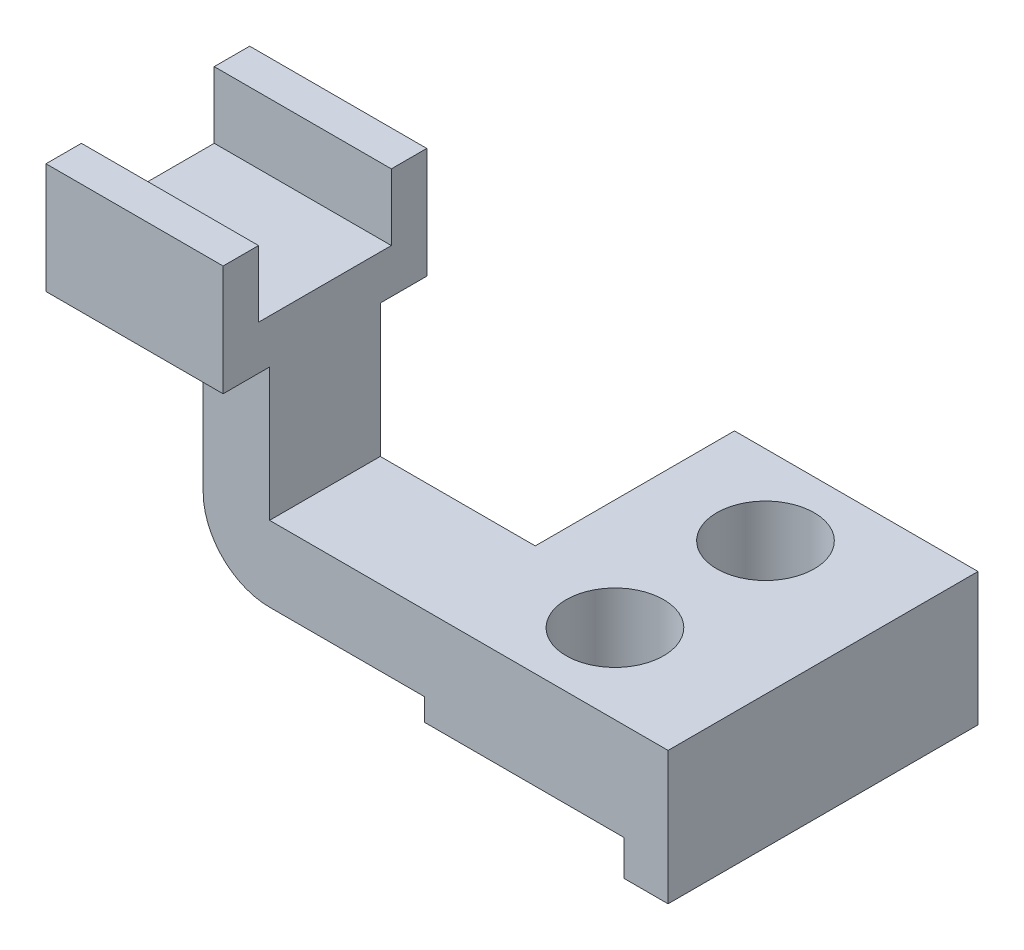
ISO-10303-21;
HEADER;
FILE_DESCRIPTION(('STEP AP214'),'2;1');
FILE_NAME('part.step','',(''),(''),'','','');
FILE_SCHEMA(('AUTOMOTIVE_DESIGN { 1 0 10303 214 1 1 1 1 }'));
ENDSEC;
DATA;
#1=APPLICATION_CONTEXT('core data for automotive mechanical design processes');
#2=APPLICATION_PROTOCOL_DEFINITION('international standard','automotive_design',2000,#1);
#3=PRODUCT_CONTEXT('',#1,'mechanical');
#4=PRODUCT('Part','Part','',(#3));
#5=PRODUCT_RELATED_PRODUCT_CATEGORY('part','',(#4));
#6=PRODUCT_DEFINITION_FORMATION('','',#4);
#7=PRODUCT_DEFINITION_CONTEXT('part definition',#1,'design');
#8=PRODUCT_DEFINITION('design','',#6,#7);
#9=PRODUCT_DEFINITION_SHAPE('','',#8);
#10=(LENGTH_UNIT() NAMED_UNIT(*) SI_UNIT(.MILLI.,.METRE.));
#11=(NAMED_UNIT(*) PLANE_ANGLE_UNIT() SI_UNIT($,.RADIAN.));
#12=(NAMED_UNIT(*) SI_UNIT($,.STERADIAN.) SOLID_ANGLE_UNIT());
#13=UNCERTAINTY_MEASURE_WITH_UNIT(LENGTH_MEASURE(1.E-05),#10,'distance_accuracy_value','');
#14=(GEOMETRIC_REPRESENTATION_CONTEXT(3) GLOBAL_UNCERTAINTY_ASSIGNED_CONTEXT((#13)) GLOBAL_UNIT_ASSIGNED_CONTEXT((#10,
#11,#12)) REPRESENTATION_CONTEXT('',''));
#15=CARTESIAN_POINT('',(0.,0.,0.));
#16=DIRECTION('',(0.,0.,1.));
#17=DIRECTION('',(1.,0.,0.));
#18=AXIS2_PLACEMENT_3D('',#15,#16,#17);
#19=CARTESIAN_POINT('',(0.,69.6989025069569,0.));
#20=DIRECTION('',(0.,1.,0.));
#21=DIRECTION('',(0.,0.,1.));
#22=AXIS2_PLACEMENT_3D('',#19,#20,#21);
#23=PLANE('',#22);
#24=DIRECTION('',(1.,0.,0.));
#25=VECTOR('',#24,1.);
#26=CARTESIAN_POINT('',(0.,69.6989025069569,2.5));
#27=LINE('',#26,#25);
#28=CARTESIAN_POINT('',(-90.8897650489965,69.6989025069569,2.5));
#29=VERTEX_POINT('',#28);
#30=CARTESIAN_POINT('',(-50.8897650489965,69.6989025069569,2.5));
#31=VERTEX_POINT('',#30);
#32=EDGE_CURVE('E366',#29,#31,#27,.T.);
#33=ORIENTED_EDGE('',*,*,#32,.F.);
#34=DIRECTION('',(0.,0.,1.));
#35=VECTOR('',#34,1.);
#36=CARTESIAN_POINT('',(-90.8897650489965,69.6989025069569,0.));
#37=LINE('',#36,#35);
#38=CARTESIAN_POINT('',(-90.8897650489965,69.6989025069569,10.5));
#39=VERTEX_POINT('',#38);
#40=EDGE_CURVE('E357',#29,#39,#37,.T.);
#41=ORIENTED_EDGE('',*,*,#40,.T.);
#42=DIRECTION('',(1.,0.,0.));
#43=VECTOR('',#42,1.);
#44=CARTESIAN_POINT('',(0.,69.6989025069569,10.5));
#45=LINE('',#44,#43);
#46=CARTESIAN_POINT('',(-50.8897650489965,69.6989025069569,10.5));
#47=VERTEX_POINT('',#46);
#48=EDGE_CURVE('E268',#39,#47,#45,.T.);
#49=ORIENTED_EDGE('',*,*,#48,.T.);
#50=DIRECTION('',(0.,0.,-1.));
#51=VECTOR('',#50,1.);
#52=CARTESIAN_POINT('',(-50.8897650489965,69.6989025069569,0.));
#53=LINE('',#52,#51);
#54=EDGE_CURVE('E341',#47,#31,#53,.T.);
#55=ORIENTED_EDGE('',*,*,#54,.T.);
#56=EDGE_LOOP('',(#33,#41,#49,#55));
#57=FACE_BOUND('',#56,.T.);
#58=ADVANCED_FACE('F41',(#57),#23,.T.);
#59=CARTESIAN_POINT('',(0.,0.,-25.));
#60=DIRECTION('',(0.,0.,1.));
#61=DIRECTION('',(1.,0.,0.));
#62=AXIS2_PLACEMENT_3D('',#59,#60,#61);
#63=PLANE('',#62);
#64=DIRECTION('',(0.,1.,0.));
#65=VECTOR('',#64,1.);
#66=CARTESIAN_POINT('',(-15.8897650489965,-2.30109749304307,-25.));
#67=LINE('',#66,#65);
#68=CARTESIAN_POINT('',(-15.8897650489965,-2.30109749304307,-25.));
#69=VERTEX_POINT('',#68);
#70=CARTESIAN_POINT('',(-15.8897650489965,14.6989025069569,-25.));
#71=VERTEX_POINT('',#70);
#72=EDGE_CURVE('E11',#69,#71,#67,.T.);
#73=ORIENTED_EDGE('',*,*,#72,.F.);
#74=DIRECTION('',(1.,0.,0.));
#75=VECTOR('',#74,1.);
#76=CARTESIAN_POINT('',(0.,-2.30109749304307,-25.));
#77=LINE('',#76,#75);
#78=CARTESIAN_POINT('',(-50.8897650489965,-2.30109749304307,-25.));
#79=VERTEX_POINT('',#78);
#80=EDGE_CURVE('E148',#79,#69,#77,.T.);
#81=ORIENTED_EDGE('',*,*,#80,.F.);
#82=CARTESIAN_POINT('',(-50.8897650489965,12.6989025069569,-25.));
#83=DIRECTION('',(0.,0.,1.));
#84=DIRECTION('',(1.,0.,0.));
#85=AXIS2_PLACEMENT_3D('',#82,#83,#84);
#86=CIRCLE('',#85,15.);
#87=CARTESIAN_POINT('',(-65.8897650489965,12.6989025069569,-25.));
#88=VERTEX_POINT('',#87);
#89=EDGE_CURVE('E130',#88,#79,#86,.T.);
#90=ORIENTED_EDGE('',*,*,#89,.F.);
#91=DIRECTION('',(0.,1.,0.));
#92=VECTOR('',#91,1.);
#93=CARTESIAN_POINT('',(-65.8897650489965,0.,-25.));
#94=LINE('',#93,#92);
#95=CARTESIAN_POINT('',(-65.8897650489965,44.6989025069569,-25.));
#96=VERTEX_POINT('',#95);
#97=EDGE_CURVE('E140',#88,#96,#94,.T.);
#98=ORIENTED_EDGE('',*,*,#97,.T.);
#99=DIRECTION('',(1.,0.,0.));
#100=VECTOR('',#99,1.);
#101=CARTESIAN_POINT('',(0.,44.6989025069569,-25.));
#102=LINE('',#101,#100);
#103=CARTESIAN_POINT('',(-50.8897650489965,44.6989025069569,-25.));
#104=VERTEX_POINT('',#103);
#105=EDGE_CURVE('E144',#96,#104,#102,.T.);
#106=ORIENTED_EDGE('',*,*,#105,.T.);
#107=DIRECTION('',(0.,-1.,0.));
#108=VECTOR('',#107,1.);
#109=CARTESIAN_POINT('',(-50.8897650489965,0.,-25.));
#110=LINE('',#109,#108);
#111=CARTESIAN_POINT('',(-50.8897650489965,14.6989025069569,-25.));
#112=VERTEX_POINT('',#111);
#113=EDGE_CURVE('E241',#104,#112,#110,.T.);
#114=ORIENTED_EDGE('',*,*,#113,.T.);
#115=DIRECTION('',(-1.,0.,0.));
#116=VECTOR('',#115,1.);
#117=CARTESIAN_POINT('',(0.,14.6989025069569,-25.));
#118=LINE('',#117,#116);
#119=EDGE_CURVE('E112',#71,#112,#118,.T.);
#120=ORIENTED_EDGE('',*,*,#119,.F.);
#121=EDGE_LOOP('',(#73,#81,#90,#98,#106,#114,#120));
#122=FACE_BOUND('',#121,.T.);
#123=ADVANCED_FACE('F146',(#122),#63,.F.);
#124=CARTESIAN_POINT('',(0.,-15.3155808543021,-25.));
#125=DIRECTION('',(0.,-1.,0.));
#126=DIRECTION('',(0.,0.,-1.));
#127=AXIS2_PLACEMENT_3D('',#124,#125,#126);
#128=PLANE('',#127);
#129=DIRECTION('',(1.,0.,0.));
#130=VECTOR('',#129,1.);
#131=CARTESIAN_POINT('',(0.,-15.3155808543021,0.));
#132=LINE('',#131,#130);
#133=CARTESIAN_POINT('',(29.1102349510035,-15.3155808543021,0.));
#134=VERTEX_POINT('',#133);
#135=CARTESIAN_POINT('',(39.1102349510035,-15.3155808543021,0.));
#136=VERTEX_POINT('',#135);
#137=EDGE_CURVE('E153',#134,#136,#132,.T.);
#138=ORIENTED_EDGE('',*,*,#137,.F.);
#139=DIRECTION('',(0.,0.,1.));
#140=VECTOR('',#139,1.);
#141=CARTESIAN_POINT('',(29.1102349510035,-15.3155808543021,-25.));
#142=LINE('',#141,#140);
#143=CARTESIAN_POINT('',(29.1102349510035,-15.3155808543021,-70.));
#144=VERTEX_POINT('',#143);
#145=EDGE_CURVE('E50',#144,#134,#142,.T.);
#146=ORIENTED_EDGE('',*,*,#145,.F.);
#147=DIRECTION('',(-1.,0.,0.));
#148=VECTOR('',#147,1.);
#149=CARTESIAN_POINT('',(39.1102349510035,-15.3155808543021,-70.));
#150=LINE('',#149,#148);
#151=CARTESIAN_POINT('',(39.1102349510035,-15.3155808543021,-70.));
#152=VERTEX_POINT('',#151);
#153=EDGE_CURVE('E204',#152,#144,#150,.T.);
#154=ORIENTED_EDGE('',*,*,#153,.F.);
#155=DIRECTION('',(0.,0.,1.));
#156=VECTOR('',#155,1.);
#157=CARTESIAN_POINT('',(39.1102349510035,-15.3155808543021,-25.));
#158=LINE('',#157,#156);
#159=EDGE_CURVE('E45',#152,#136,#158,.T.);
#160=ORIENTED_EDGE('',*,*,#159,.T.);
#161=EDGE_LOOP('',(#138,#146,#154,#160));
#162=FACE_BOUND('',#161,.T.);
#163=ADVANCED_FACE('F43',(#162),#128,.T.);
#164=CARTESIAN_POINT('',(29.1102349510035,0.,-25.));
#165=DIRECTION('',(-1.,0.,0.));
#166=DIRECTION('',(0.,0.,1.));
#167=AXIS2_PLACEMENT_3D('',#164,#165,#166);
#168=PLANE('',#167);
#169=DIRECTION('',(0.,-1.,0.));
#170=VECTOR('',#169,1.);
#171=CARTESIAN_POINT('',(29.1102349510035,0.,0.));
#172=LINE('',#171,#170);
#173=CARTESIAN_POINT('',(29.1102349510035,-7.31558085430206,0.));
#174=VERTEX_POINT('',#173);
#175=EDGE_CURVE('E181',#174,#134,#172,.T.);
#176=ORIENTED_EDGE('',*,*,#175,.F.);
#177=DIRECTION('',(0.,0.,1.));
#178=VECTOR('',#177,1.);
#179=CARTESIAN_POINT('',(29.1102349510035,-7.31558085430206,-25.));
#180=LINE('',#179,#178);
#181=CARTESIAN_POINT('',(29.1102349510035,-7.31558085430206,-70.));
#182=VERTEX_POINT('',#181);
#183=EDGE_CURVE('E185',#182,#174,#180,.T.);
#184=ORIENTED_EDGE('',*,*,#183,.F.);
#185=DIRECTION('',(0.,1.,0.));
#186=VECTOR('',#185,1.);
#187=CARTESIAN_POINT('',(29.1102349510035,-15.3155808543021,-70.));
#188=LINE('',#187,#186);
#189=EDGE_CURVE('E215',#144,#182,#188,.T.);
#190=ORIENTED_EDGE('',*,*,#189,.F.);
#191=ORIENTED_EDGE('',*,*,#145,.T.);
#192=EDGE_LOOP('',(#176,#184,#190,#191));
#193=FACE_BOUND('',#192,.T.);
#194=ADVANCED_FACE('F211',(#193),#168,.T.);
#195=CARTESIAN_POINT('',(0.,-7.31558085430206,-25.));
#196=DIRECTION('',(0.,-1.,0.));
#197=DIRECTION('',(0.,0.,-1.));
#198=AXIS2_PLACEMENT_3D('',#195,#196,#197);
#199=PLANE('',#198);
#200=CARTESIAN_POINT('',(9.11023495100352,-7.31558085430206,-18.));
#201=DIRECTION('',(0.,-1.,0.));
#202=DIRECTION('',(0.,0.,-1.));
#203=AXIS2_PLACEMENT_3D('',#200,#201,#202);
#204=CIRCLE('',#203,11.);
#205=CARTESIAN_POINT('',(-1.88976504899648,-7.31558085430206,-18.));
#206=VERTEX_POINT('',#205);
#207=EDGE_CURVE('E372',#206,#206,#204,.T.);
#208=ORIENTED_EDGE('',*,*,#207,.F.);
#209=EDGE_LOOP('',(#208));
#210=FACE_BOUND('',#209,.T.);
#211=CARTESIAN_POINT('',(9.11023495100352,-7.31558085430206,-52.));
#212=DIRECTION('',(0.,-1.,0.));
#213=DIRECTION('',(0.,0.,-1.));
#214=AXIS2_PLACEMENT_3D('',#211,#212,#213);
#215=CIRCLE('',#214,11.);
#216=CARTESIAN_POINT('',(-1.88976504899648,-7.31558085430206,-52.));
#217=VERTEX_POINT('',#216);
#218=EDGE_CURVE('E385',#217,#217,#215,.T.);
#219=ORIENTED_EDGE('',*,*,#218,.F.);
#220=EDGE_LOOP('',(#219));
#221=FACE_BOUND('',#220,.T.);
#222=DIRECTION('',(1.,0.,0.));
#223=VECTOR('',#222,1.);
#224=CARTESIAN_POINT('',(0.,-7.31558085430206,0.));
#225=LINE('',#224,#223);
#226=CARTESIAN_POINT('',(-15.8897650489965,-7.31558085430206,0.));
#227=VERTEX_POINT('',#226);
#228=EDGE_CURVE('E178',#227,#174,#225,.T.);
#229=ORIENTED_EDGE('',*,*,#228,.F.);
#230=DIRECTION('',(0.,0.,1.));
#231=VECTOR('',#230,1.);
#232=CARTESIAN_POINT('',(-15.8897650489965,-7.31558085430206,-25.));
#233=LINE('',#232,#231);
#234=CARTESIAN_POINT('',(-15.8897650489965,-7.31558085430206,-70.));
#235=VERTEX_POINT('',#234);
#236=EDGE_CURVE('E187',#235,#227,#233,.T.);
#237=ORIENTED_EDGE('',*,*,#236,.F.);
#238=DIRECTION('',(-1.,0.,0.));
#239=VECTOR('',#238,1.);
#240=CARTESIAN_POINT('',(29.1102349510035,-7.31558085430206,-70.));
#241=LINE('',#240,#239);
#242=EDGE_CURVE('E224',#182,#235,#241,.T.);
#243=ORIENTED_EDGE('',*,*,#242,.F.);
#244=ORIENTED_EDGE('',*,*,#183,.T.);
#245=EDGE_LOOP('',(#229,#237,#243,#244));
#246=FACE_BOUND('',#245,.T.);
#247=ADVANCED_FACE('F228',(#210,#221,#246),#199,.T.);
#248=CARTESIAN_POINT('',(-15.8897650489965,0.,-25.));
#249=DIRECTION('',(-1.,0.,0.));
#250=DIRECTION('',(0.,0.,1.));
#251=AXIS2_PLACEMENT_3D('',#248,#249,#250);
#252=PLANE('',#251);
#253=DIRECTION('',(0.,-1.,0.));
#254=VECTOR('',#253,1.);
#255=CARTESIAN_POINT('',(-15.8897650489965,0.,0.));
#256=LINE('',#255,#254);
#257=CARTESIAN_POINT('',(-15.8897650489965,-2.30109749304307,0.));
#258=VERTEX_POINT('',#257);
#259=EDGE_CURVE('E175',#258,#227,#256,.T.);
#260=ORIENTED_EDGE('',*,*,#259,.F.);
#261=DIRECTION('',(0.,0.,1.));
#262=VECTOR('',#261,1.);
#263=CARTESIAN_POINT('',(-15.8897650489965,-2.30109749304307,-25.));
#264=LINE('',#263,#262);
#265=EDGE_CURVE('E189',#69,#258,#264,.T.);
#266=ORIENTED_EDGE('',*,*,#265,.F.);
#267=ORIENTED_EDGE('',*,*,#72,.T.);
#268=DIRECTION('',(0.,0.,1.));
#269=VECTOR('',#268,1.);
#270=CARTESIAN_POINT('',(-15.8897650489965,14.6989025069569,-70.));
#271=LINE('',#270,#269);
#272=CARTESIAN_POINT('',(-15.8897650489965,14.6989025069569,-70.));
#273=VERTEX_POINT('',#272);
#274=EDGE_CURVE('E157',#273,#71,#271,.T.);
#275=ORIENTED_EDGE('',*,*,#274,.F.);
#276=DIRECTION('',(0.,1.,0.));
#277=VECTOR('',#276,1.);
#278=CARTESIAN_POINT('',(-15.8897650489965,-2.30109749304307,-70.));
#279=LINE('',#278,#277);
#280=EDGE_CURVE('E229',#235,#273,#279,.T.);
#281=ORIENTED_EDGE('',*,*,#280,.F.);
#282=ORIENTED_EDGE('',*,*,#236,.T.);
#283=EDGE_LOOP('',(#260,#266,#267,#275,#281,#282));
#284=FACE_BOUND('',#283,.T.);
#285=ADVANCED_FACE('F332',(#284),#252,.T.);
#286=CARTESIAN_POINT('',(0.,-2.30109749304307,-25.));
#287=DIRECTION('',(0.,-1.,0.));
#288=DIRECTION('',(1.,0.,0.));
#289=AXIS2_PLACEMENT_3D('',#286,#287,#288);
#290=PLANE('',#289);
#291=DIRECTION('',(1.,0.,0.));
#292=VECTOR('',#291,1.);
#293=CARTESIAN_POINT('',(0.,-2.30109749304307,0.));
#294=LINE('',#293,#292);
#295=CARTESIAN_POINT('',(-50.8897650489965,-2.30109749304307,0.));
#296=VERTEX_POINT('',#295);
#297=EDGE_CURVE('E172',#296,#258,#294,.T.);
#298=ORIENTED_EDGE('',*,*,#297,.F.);
#299=DIRECTION('',(0.,0.,1.));
#300=VECTOR('',#299,1.);
#301=CARTESIAN_POINT('',(-50.8897650489965,-2.30109749304307,-25.));
#302=LINE('',#301,#300);
#303=EDGE_CURVE('E136',#79,#296,#302,.T.);
#304=ORIENTED_EDGE('',*,*,#303,.F.);
#305=ORIENTED_EDGE('',*,*,#80,.T.);
#306=ORIENTED_EDGE('',*,*,#265,.T.);
#307=EDGE_LOOP('',(#298,#304,#305,#306));
#308=FACE_BOUND('',#307,.T.);
#309=ADVANCED_FACE('F335',(#308),#290,.T.);
#310=CARTESIAN_POINT('',(-50.8897650489965,12.6989025069569,-25.));
#311=DIRECTION('',(0.,0.,1.));
#312=DIRECTION('',(1.,0.,0.));
#313=AXIS2_PLACEMENT_3D('',#310,#311,#312);
#314=CYLINDRICAL_SURFACE('',#313,15.);
#315=CARTESIAN_POINT('',(-50.8897650489965,12.6989025069569,0.));
#316=DIRECTION('',(0.,0.,1.));
#317=DIRECTION('',(1.,0.,0.));
#318=AXIS2_PLACEMENT_3D('',#315,#316,#317);
#319=CIRCLE('',#318,15.);
#320=CARTESIAN_POINT('',(-65.8897650489965,12.6989025069569,0.));
#321=VERTEX_POINT('',#320);
#322=EDGE_CURVE('E132',#321,#296,#319,.T.);
#323=ORIENTED_EDGE('',*,*,#322,.F.);
#324=DIRECTION('',(0.,0.,1.));
#325=VECTOR('',#324,1.);
#326=CARTESIAN_POINT('',(-65.8897650489965,12.6989025069569,-25.));
#327=LINE('',#326,#325);
#328=EDGE_CURVE('E126',#88,#321,#327,.T.);
#329=ORIENTED_EDGE('',*,*,#328,.F.);
#330=ORIENTED_EDGE('',*,*,#89,.T.);
#331=ORIENTED_EDGE('',*,*,#303,.T.);
#332=EDGE_LOOP('',(#323,#329,#330,#331));
#333=FACE_BOUND('',#332,.T.);
#334=ADVANCED_FACE('F128',(#333),#314,.T.);
#335=CARTESIAN_POINT('',(-65.8897650489965,0.,-25.));
#336=DIRECTION('',(1.,0.,0.));
#337=DIRECTION('',(0.,1.,0.));
#338=AXIS2_PLACEMENT_3D('',#335,#336,#337);
#339=PLANE('',#338);
#340=DIRECTION('',(0.,1.,0.));
#341=VECTOR('',#340,1.);
#342=CARTESIAN_POINT('',(-65.8897650489965,0.,0.));
#343=LINE('',#342,#341);
#344=CARTESIAN_POINT('',(-65.8897650489965,44.6989025069569,0.));
#345=VERTEX_POINT('',#344);
#346=EDGE_CURVE('E169',#321,#345,#343,.T.);
#347=ORIENTED_EDGE('',*,*,#346,.T.);
#348=DIRECTION('',(0.,0.,1.));
#349=VECTOR('',#348,1.);
#350=CARTESIAN_POINT('',(-65.8897650489965,44.6989025069569,-25.));
#351=LINE('',#350,#349);
#352=EDGE_CURVE('E137',#96,#345,#351,.T.);
#353=ORIENTED_EDGE('',*,*,#352,.F.);
#354=ORIENTED_EDGE('',*,*,#97,.F.);
#355=ORIENTED_EDGE('',*,*,#328,.T.);
#356=EDGE_LOOP('',(#347,#353,#354,#355));
#357=FACE_BOUND('',#356,.T.);
#358=ADVANCED_FACE('F141',(#357),#339,.F.);
#359=CARTESIAN_POINT('',(-50.8897650489965,0.,-25.));
#360=DIRECTION('',(-1.,0.,0.));
#361=DIRECTION('',(0.,-1.,0.));
#362=AXIS2_PLACEMENT_3D('',#359,#360,#361);
#363=PLANE('',#362);
#364=DIRECTION('',(0.,0.,-1.));
#365=VECTOR('',#364,1.);
#366=CARTESIAN_POINT('',(-50.8897650489965,54.6989025069569,0.));
#367=LINE('',#366,#365);
#368=CARTESIAN_POINT('',(-50.8897650489965,54.6989025069569,2.5));
#369=VERTEX_POINT('',#368);
#370=CARTESIAN_POINT('',(-50.8897650489965,54.6989025069569,-27.5));
#371=VERTEX_POINT('',#370);
#372=EDGE_CURVE('E369',#369,#371,#367,.T.);
#373=ORIENTED_EDGE('',*,*,#372,.F.);
#374=DIRECTION('',(0.,1.,0.));
#375=VECTOR('',#374,1.);
#376=CARTESIAN_POINT('',(-50.8897650489965,54.6989025069569,2.5));
#377=LINE('',#376,#375);
#378=EDGE_CURVE('E260',#369,#31,#377,.T.);
#379=ORIENTED_EDGE('',*,*,#378,.T.);
#380=ORIENTED_EDGE('',*,*,#54,.F.);
#381=DIRECTION('',(0.,-1.,0.));
#382=VECTOR('',#381,1.);
#383=CARTESIAN_POINT('',(-50.8897650489965,69.6989025069569,10.5));
#384=LINE('',#383,#382);
#385=CARTESIAN_POINT('',(-50.8897650489965,44.6989025069569,10.5));
#386=VERTEX_POINT('',#385);
#387=EDGE_CURVE('E278',#47,#386,#384,.T.);
#388=ORIENTED_EDGE('',*,*,#387,.T.);
#389=DIRECTION('',(0.,0.,-1.));
#390=VECTOR('',#389,1.);
#391=CARTESIAN_POINT('',(-50.8897650489965,44.6989025069569,0.));
#392=LINE('',#391,#390);
#393=CARTESIAN_POINT('',(-50.8897650489965,44.6989025069569,0.));
#394=VERTEX_POINT('',#393);
#395=EDGE_CURVE('E259',#386,#394,#392,.T.);
#396=ORIENTED_EDGE('',*,*,#395,.T.);
#397=DIRECTION('',(0.,-1.,0.));
#398=VECTOR('',#397,1.);
#399=CARTESIAN_POINT('',(-50.8897650489965,0.,0.));
#400=LINE('',#399,#398);
#401=CARTESIAN_POINT('',(-50.8897650489965,14.6989025069569,0.));
#402=VERTEX_POINT('',#401);
#403=EDGE_CURVE('E163',#394,#402,#400,.T.);
#404=ORIENTED_EDGE('',*,*,#403,.T.);
#405=DIRECTION('',(0.,0.,1.));
#406=VECTOR('',#405,1.);
#407=CARTESIAN_POINT('',(-50.8897650489965,14.6989025069569,-25.));
#408=LINE('',#407,#406);
#409=EDGE_CURVE('E193',#112,#402,#408,.T.);
#410=ORIENTED_EDGE('',*,*,#409,.F.);
#411=ORIENTED_EDGE('',*,*,#113,.F.);
#412=CARTESIAN_POINT('',(-50.8897650489965,44.6989025069569,-35.5));
#413=VERTEX_POINT('',#412);
#414=EDGE_CURVE('E252',#104,#413,#392,.T.);
#415=ORIENTED_EDGE('',*,*,#414,.T.);
#416=DIRECTION('',(0.,-1.,0.));
#417=VECTOR('',#416,1.);
#418=CARTESIAN_POINT('',(-50.8897650489965,69.6989025069569,-35.5));
#419=LINE('',#418,#417);
#420=CARTESIAN_POINT('',(-50.8897650489965,69.6989025069569,-35.5));
#421=VERTEX_POINT('',#420);
#422=EDGE_CURVE('E287',#421,#413,#419,.T.);
#423=ORIENTED_EDGE('',*,*,#422,.F.);
#424=CARTESIAN_POINT('',(-50.8897650489965,69.6989025069569,-27.5));
#425=VERTEX_POINT('',#424);
#426=EDGE_CURVE('E277',#425,#421,#53,.T.);
#427=ORIENTED_EDGE('',*,*,#426,.F.);
#428=DIRECTION('',(0.,1.,0.));
#429=VECTOR('',#428,1.);
#430=CARTESIAN_POINT('',(-50.8897650489965,54.6989025069569,-27.5));
#431=LINE('',#430,#429);
#432=EDGE_CURVE('E58',#371,#425,#431,.T.);
#433=ORIENTED_EDGE('',*,*,#432,.F.);
#434=EDGE_LOOP('',(#373,#379,#380,#388,#396,#404,#410,#411,#415,#423,#427,#433));
#435=FACE_BOUND('',#434,.T.);
#436=ADVANCED_FACE('F249',(#435),#363,.F.);
#437=CARTESIAN_POINT('',(0.,14.6989025069569,-25.));
#438=DIRECTION('',(0.,1.,0.));
#439=DIRECTION('',(-1.,0.,0.));
#440=AXIS2_PLACEMENT_3D('',#437,#438,#439);
#441=PLANE('',#440);
#442=CARTESIAN_POINT('',(9.11023495100352,14.6989025069569,-18.));
#443=DIRECTION('',(0.,1.,0.));
#444=DIRECTION('',(-1.,0.,0.));
#445=AXIS2_PLACEMENT_3D('',#442,#443,#444);
#446=CIRCLE('',#445,11.);
#447=CARTESIAN_POINT('',(-1.88976504899648,14.6989025069569,-18.));
#448=VERTEX_POINT('',#447);
#449=EDGE_CURVE('E388',#448,#448,#446,.T.);
#450=ORIENTED_EDGE('',*,*,#449,.F.);
#451=EDGE_LOOP('',(#450));
#452=FACE_BOUND('',#451,.T.);
#453=CARTESIAN_POINT('',(9.11023495100352,14.6989025069569,-52.));
#454=DIRECTION('',(0.,1.,0.));
#455=DIRECTION('',(-1.,0.,0.));
#456=AXIS2_PLACEMENT_3D('',#453,#454,#455);
#457=CIRCLE('',#456,11.);
#458=CARTESIAN_POINT('',(-1.88976504899648,14.6989025069569,-52.));
#459=VERTEX_POINT('',#458);
#460=EDGE_CURVE('E389',#459,#459,#457,.T.);
#461=ORIENTED_EDGE('',*,*,#460,.F.);
#462=EDGE_LOOP('',(#461));
#463=FACE_BOUND('',#462,.T.);
#464=DIRECTION('',(-1.,0.,0.));
#465=VECTOR('',#464,1.);
#466=CARTESIAN_POINT('',(0.,14.6989025069569,0.));
#467=LINE('',#466,#465);
#468=CARTESIAN_POINT('',(39.1102349510035,14.6989025069569,0.));
#469=VERTEX_POINT('',#468);
#470=EDGE_CURVE('E160',#469,#402,#467,.T.);
#471=ORIENTED_EDGE('',*,*,#470,.F.);
#472=DIRECTION('',(0.,0.,1.));
#473=VECTOR('',#472,1.);
#474=CARTESIAN_POINT('',(39.1102349510035,14.6989025069569,-25.));
#475=LINE('',#474,#473);
#476=CARTESIAN_POINT('',(39.1102349510035,14.6989025069569,-70.));
#477=VERTEX_POINT('',#476);
#478=EDGE_CURVE('E194',#477,#469,#475,.T.);
#479=ORIENTED_EDGE('',*,*,#478,.F.);
#480=DIRECTION('',(1.,0.,0.));
#481=VECTOR('',#480,1.);
#482=CARTESIAN_POINT('',(-15.8897650489965,14.6989025069569,-70.));
#483=LINE('',#482,#481);
#484=EDGE_CURVE('E231',#273,#477,#483,.T.);
#485=ORIENTED_EDGE('',*,*,#484,.F.);
#486=ORIENTED_EDGE('',*,*,#274,.T.);
#487=ORIENTED_EDGE('',*,*,#119,.T.);
#488=ORIENTED_EDGE('',*,*,#409,.T.);
#489=EDGE_LOOP('',(#471,#479,#485,#486,#487,#488));
#490=FACE_BOUND('',#489,.T.);
#491=ADVANCED_FACE('F328',(#452,#463,#490),#441,.T.);
#492=CARTESIAN_POINT('',(39.1102349510035,0.,-25.));
#493=DIRECTION('',(1.,0.,0.));
#494=DIRECTION('',(0.,1.,0.));
#495=AXIS2_PLACEMENT_3D('',#492,#493,#494);
#496=PLANE('',#495);
#497=DIRECTION('',(0.,1.,0.));
#498=VECTOR('',#497,1.);
#499=CARTESIAN_POINT('',(39.1102349510035,0.,0.));
#500=LINE('',#499,#498);
#501=EDGE_CURVE('E156',#136,#469,#500,.T.);
#502=ORIENTED_EDGE('',*,*,#501,.F.);
#503=ORIENTED_EDGE('',*,*,#159,.F.);
#504=DIRECTION('',(0.,-1.,0.));
#505=VECTOR('',#504,1.);
#506=CARTESIAN_POINT('',(39.1102349510035,-15.3155808543021,-70.));
#507=LINE('',#506,#505);
#508=EDGE_CURVE('E237',#477,#152,#507,.T.);
#509=ORIENTED_EDGE('',*,*,#508,.F.);
#510=ORIENTED_EDGE('',*,*,#478,.T.);
#511=EDGE_LOOP('',(#502,#503,#509,#510));
#512=FACE_BOUND('',#511,.T.);
#513=ADVANCED_FACE('F206',(#512),#496,.T.);
#514=CARTESIAN_POINT('',(0.,0.,0.));
#515=DIRECTION('',(0.,0.,1.));
#516=DIRECTION('',(1.,0.,0.));
#517=AXIS2_PLACEMENT_3D('',#514,#515,#516);
#518=PLANE('',#517);
#519=ORIENTED_EDGE('',*,*,#137,.T.);
#520=ORIENTED_EDGE('',*,*,#501,.T.);
#521=ORIENTED_EDGE('',*,*,#470,.T.);
#522=ORIENTED_EDGE('',*,*,#403,.F.);
#523=DIRECTION('',(1.,0.,0.));
#524=VECTOR('',#523,1.);
#525=CARTESIAN_POINT('',(0.,44.6989025069569,0.));
#526=LINE('',#525,#524);
#527=EDGE_CURVE('E166',#345,#394,#526,.T.);
#528=ORIENTED_EDGE('',*,*,#527,.F.);
#529=ORIENTED_EDGE('',*,*,#346,.F.);
#530=ORIENTED_EDGE('',*,*,#322,.T.);
#531=ORIENTED_EDGE('',*,*,#297,.T.);
#532=ORIENTED_EDGE('',*,*,#259,.T.);
#533=ORIENTED_EDGE('',*,*,#228,.T.);
#534=ORIENTED_EDGE('',*,*,#175,.T.);
#535=EDGE_LOOP('',(#519,#520,#521,#522,#528,#529,#530,#531,#532,#533,#534));
#536=FACE_BOUND('',#535,.T.);
#537=ADVANCED_FACE('F208',(#536),#518,.T.);
#538=CARTESIAN_POINT('',(0.,0.,-70.));
#539=DIRECTION('',(0.,0.,-1.));
#540=DIRECTION('',(-1.,0.,0.));
#541=AXIS2_PLACEMENT_3D('',#538,#539,#540);
#542=PLANE('',#541);
#543=ORIENTED_EDGE('',*,*,#153,.T.);
#544=ORIENTED_EDGE('',*,*,#189,.T.);
#545=ORIENTED_EDGE('',*,*,#242,.T.);
#546=ORIENTED_EDGE('',*,*,#280,.T.);
#547=ORIENTED_EDGE('',*,*,#484,.T.);
#548=ORIENTED_EDGE('',*,*,#508,.T.);
#549=EDGE_LOOP('',(#543,#544,#545,#546,#547,#548));
#550=FACE_BOUND('',#549,.T.);
#551=ADVANCED_FACE('F222',(#550),#542,.T.);
#552=CARTESIAN_POINT('',(0.,44.6989025069569,0.));
#553=DIRECTION('',(0.,1.,0.));
#554=DIRECTION('',(0.,0.,1.));
#555=AXIS2_PLACEMENT_3D('',#552,#553,#554);
#556=PLANE('',#555);
#557=ORIENTED_EDGE('',*,*,#352,.T.);
#558=ORIENTED_EDGE('',*,*,#527,.T.);
#559=ORIENTED_EDGE('',*,*,#395,.F.);
#560=DIRECTION('',(1.,0.,0.));
#561=VECTOR('',#560,1.);
#562=CARTESIAN_POINT('',(0.,44.6989025069569,10.5));
#563=LINE('',#562,#561);
#564=CARTESIAN_POINT('',(-90.8897650489965,44.6989025069569,10.5));
#565=VERTEX_POINT('',#564);
#566=EDGE_CURVE('E274',#565,#386,#563,.T.);
#567=ORIENTED_EDGE('',*,*,#566,.F.);
#568=DIRECTION('',(0.,0.,1.));
#569=VECTOR('',#568,1.);
#570=CARTESIAN_POINT('',(-90.8897650489965,44.6989025069569,0.));
#571=LINE('',#570,#569);
#572=CARTESIAN_POINT('',(-90.8897650489965,44.6989025069569,-35.5));
#573=VERTEX_POINT('',#572);
#574=EDGE_CURVE('E271',#573,#565,#571,.T.);
#575=ORIENTED_EDGE('',*,*,#574,.F.);
#576=DIRECTION('',(-1.,0.,0.));
#577=VECTOR('',#576,1.);
#578=CARTESIAN_POINT('',(0.,44.6989025069569,-35.5));
#579=LINE('',#578,#577);
#580=EDGE_CURVE('E257',#413,#573,#579,.T.);
#581=ORIENTED_EDGE('',*,*,#580,.F.);
#582=ORIENTED_EDGE('',*,*,#414,.F.);
#583=ORIENTED_EDGE('',*,*,#105,.F.);
#584=EDGE_LOOP('',(#557,#558,#559,#567,#575,#581,#582,#583));
#585=FACE_BOUND('',#584,.T.);
#586=ADVANCED_FACE('F254',(#585),#556,.F.);
#587=CARTESIAN_POINT('',(0.,69.6989025069569,-35.5));
#588=DIRECTION('',(0.,0.,1.));
#589=DIRECTION('',(1.,0.,0.));
#590=AXIS2_PLACEMENT_3D('',#587,#588,#589);
#591=PLANE('',#590);
#592=ORIENTED_EDGE('',*,*,#580,.T.);
#593=DIRECTION('',(0.,-1.,0.));
#594=VECTOR('',#593,1.);
#595=CARTESIAN_POINT('',(-90.8897650489965,69.6989025069569,-35.5));
#596=LINE('',#595,#594);
#597=CARTESIAN_POINT('',(-90.8897650489965,69.6989025069569,-35.5));
#598=VERTEX_POINT('',#597);
#599=EDGE_CURVE('E284',#598,#573,#596,.T.);
#600=ORIENTED_EDGE('',*,*,#599,.F.);
#601=DIRECTION('',(-1.,0.,0.));
#602=VECTOR('',#601,1.);
#603=CARTESIAN_POINT('',(0.,69.6989025069569,-35.5));
#604=LINE('',#603,#602);
#605=EDGE_CURVE('E295',#421,#598,#604,.T.);
#606=ORIENTED_EDGE('',*,*,#605,.F.);
#607=ORIENTED_EDGE('',*,*,#422,.T.);
#608=EDGE_LOOP('',(#592,#600,#606,#607));
#609=FACE_BOUND('',#608,.T.);
#610=ADVANCED_FACE('F290',(#609),#591,.F.);
#611=CARTESIAN_POINT('',(-90.8897650489965,69.6989025069569,0.));
#612=DIRECTION('',(1.,0.,0.));
#613=DIRECTION('',(0.,0.,-1.));
#614=AXIS2_PLACEMENT_3D('',#611,#612,#613);
#615=PLANE('',#614);
#616=ORIENTED_EDGE('',*,*,#40,.F.);
#617=DIRECTION('',(0.,1.,0.));
#618=VECTOR('',#617,1.);
#619=CARTESIAN_POINT('',(-90.8897650489965,54.6989025069569,2.5));
#620=LINE('',#619,#618);
#621=CARTESIAN_POINT('',(-90.8897650489965,54.6989025069569,2.5));
#622=VERTEX_POINT('',#621);
#623=EDGE_CURVE('E264',#622,#29,#620,.T.);
#624=ORIENTED_EDGE('',*,*,#623,.F.);
#625=DIRECTION('',(0.,0.,1.));
#626=VECTOR('',#625,1.);
#627=CARTESIAN_POINT('',(-90.8897650489965,54.6989025069569,0.));
#628=LINE('',#627,#626);
#629=CARTESIAN_POINT('',(-90.8897650489965,54.6989025069569,-27.5));
#630=VERTEX_POINT('',#629);
#631=EDGE_CURVE('E375',#630,#622,#628,.T.);
#632=ORIENTED_EDGE('',*,*,#631,.F.);
#633=DIRECTION('',(0.,1.,0.));
#634=VECTOR('',#633,1.);
#635=CARTESIAN_POINT('',(-90.8897650489965,54.6989025069569,-27.5));
#636=LINE('',#635,#634);
#637=CARTESIAN_POINT('',(-90.8897650489965,69.6989025069569,-27.5));
#638=VERTEX_POINT('',#637);
#639=EDGE_CURVE('E356',#630,#638,#636,.T.);
#640=ORIENTED_EDGE('',*,*,#639,.T.);
#641=EDGE_CURVE('E352',#598,#638,#37,.T.);
#642=ORIENTED_EDGE('',*,*,#641,.F.);
#643=ORIENTED_EDGE('',*,*,#599,.T.);
#644=ORIENTED_EDGE('',*,*,#574,.T.);
#645=DIRECTION('',(0.,-1.,0.));
#646=VECTOR('',#645,1.);
#647=CARTESIAN_POINT('',(-90.8897650489965,69.6989025069569,10.5));
#648=LINE('',#647,#646);
#649=EDGE_CURVE('E281',#39,#565,#648,.T.);
#650=ORIENTED_EDGE('',*,*,#649,.F.);
#651=EDGE_LOOP('',(#616,#624,#632,#640,#642,#643,#644,#650));
#652=FACE_BOUND('',#651,.T.);
#653=ADVANCED_FACE('F348',(#652),#615,.F.);
#654=CARTESIAN_POINT('',(0.,69.6989025069569,10.5));
#655=DIRECTION('',(0.,0.,-1.));
#656=DIRECTION('',(-1.,0.,0.));
#657=AXIS2_PLACEMENT_3D('',#654,#655,#656);
#658=PLANE('',#657);
#659=ORIENTED_EDGE('',*,*,#566,.T.);
#660=ORIENTED_EDGE('',*,*,#387,.F.);
#661=ORIENTED_EDGE('',*,*,#48,.F.);
#662=ORIENTED_EDGE('',*,*,#649,.T.);
#663=EDGE_LOOP('',(#659,#660,#661,#662));
#664=FACE_BOUND('',#663,.T.);
#665=ADVANCED_FACE('F344',(#664),#658,.F.);
#666=DIRECTION('',(-1.,0.,0.));
#667=VECTOR('',#666,1.);
#668=CARTESIAN_POINT('',(0.,69.6989025069569,-27.5));
#669=LINE('',#668,#667);
#670=EDGE_CURVE('E370',#425,#638,#669,.T.);
#671=ORIENTED_EDGE('',*,*,#670,.F.);
#672=ORIENTED_EDGE('',*,*,#426,.T.);
#673=ORIENTED_EDGE('',*,*,#605,.T.);
#674=ORIENTED_EDGE('',*,*,#641,.T.);
#675=EDGE_LOOP('',(#671,#672,#673,#674));
#676=FACE_BOUND('',#675,.T.);
#677=ADVANCED_FACE('F419',(#676),#23,.T.);
#678=CARTESIAN_POINT('',(0.,54.6989025069569,2.5));
#679=DIRECTION('',(0.,0.,1.));
#680=DIRECTION('',(1.,0.,0.));
#681=AXIS2_PLACEMENT_3D('',#678,#679,#680);
#682=PLANE('',#681);
#683=ORIENTED_EDGE('',*,*,#32,.T.);
#684=ORIENTED_EDGE('',*,*,#378,.F.);
#685=DIRECTION('',(1.,0.,0.));
#686=VECTOR('',#685,1.);
#687=CARTESIAN_POINT('',(0.,54.6989025069569,2.5));
#688=LINE('',#687,#686);
#689=EDGE_CURVE('E362',#622,#369,#688,.T.);
#690=ORIENTED_EDGE('',*,*,#689,.F.);
#691=ORIENTED_EDGE('',*,*,#623,.T.);
#692=EDGE_LOOP('',(#683,#684,#690,#691));
#693=FACE_BOUND('',#692,.T.);
#694=ADVANCED_FACE('F428',(#693),#682,.F.);
#695=CARTESIAN_POINT('',(0.,54.6989025069569,-27.5));
#696=DIRECTION('',(0.,0.,-1.));
#697=DIRECTION('',(-1.,0.,0.));
#698=AXIS2_PLACEMENT_3D('',#695,#696,#697);
#699=PLANE('',#698);
#700=ORIENTED_EDGE('',*,*,#670,.T.);
#701=ORIENTED_EDGE('',*,*,#639,.F.);
#702=DIRECTION('',(-1.,0.,0.));
#703=VECTOR('',#702,1.);
#704=CARTESIAN_POINT('',(0.,54.6989025069569,-27.5));
#705=LINE('',#704,#703);
#706=EDGE_CURVE('E378',#371,#630,#705,.T.);
#707=ORIENTED_EDGE('',*,*,#706,.F.);
#708=ORIENTED_EDGE('',*,*,#432,.T.);
#709=EDGE_LOOP('',(#700,#701,#707,#708));
#710=FACE_BOUND('',#709,.T.);
#711=ADVANCED_FACE('F413',(#710),#699,.F.);
#712=CARTESIAN_POINT('',(0.,54.6989025069569,0.));
#713=DIRECTION('',(0.,1.,0.));
#714=DIRECTION('',(0.,0.,1.));
#715=AXIS2_PLACEMENT_3D('',#712,#713,#714);
#716=PLANE('',#715);
#717=ORIENTED_EDGE('',*,*,#372,.T.);
#718=ORIENTED_EDGE('',*,*,#706,.T.);
#719=ORIENTED_EDGE('',*,*,#631,.T.);
#720=ORIENTED_EDGE('',*,*,#689,.T.);
#721=EDGE_LOOP('',(#717,#718,#719,#720));
#722=FACE_BOUND('',#721,.T.);
#723=ADVANCED_FACE('F404',(#722),#716,.T.);
#724=CARTESIAN_POINT('',(9.11023495100352,-15.3155808543021,-52.));
#725=DIRECTION('',(0.,1.,0.));
#726=DIRECTION('',(-1.,0.,0.));
#727=AXIS2_PLACEMENT_3D('',#724,#725,#726);
#728=CYLINDRICAL_SURFACE('',#727,11.);
#729=CARTESIAN_POINT('',(-1.88976504899648,-7.31558085430206,-52.));
#730=CARTESIAN_POINT('',(-1.88976504899648,-7.08626331928895,-52.));
#731=CARTESIAN_POINT('',(-1.88976504899648,-6.85694578427583,-52.));
#732=CARTESIAN_POINT('',(-1.88976504899648,-6.3983107142496,-52.));
#733=CARTESIAN_POINT('',(-1.88976504899648,-6.16899317923649,-52.));
#734=CARTESIAN_POINT('',(-1.88976504899648,-5.71035810921026,-52.));
#735=CARTESIAN_POINT('',(-1.88976504899648,-5.48104057419715,-52.));
#736=CARTESIAN_POINT('',(-1.88976504899648,-5.02240550417092,-52.));
#737=CARTESIAN_POINT('',(-1.88976504899648,-4.7930879691578,-52.));
#738=CARTESIAN_POINT('',(-1.88976504899648,-4.33445289913157,-52.));
#739=CARTESIAN_POINT('',(-1.88976504899648,-4.10513536411846,-52.));
#740=CARTESIAN_POINT('',(-1.88976504899648,-3.64650029409223,-52.));
#741=CARTESIAN_POINT('',(-1.88976504899648,-3.41718275907912,-52.));
#742=CARTESIAN_POINT('',(-1.88976504899648,-2.95854768905289,-52.));
#743=CARTESIAN_POINT('',(-1.88976504899648,-2.72923015403977,-52.));
#744=CARTESIAN_POINT('',(-1.88976504899648,-2.27059508401354,-52.));
#745=CARTESIAN_POINT('',(-1.88976504899648,-2.04127754900043,-52.));
#746=CARTESIAN_POINT('',(-1.88976504899648,-1.5826424789742,-52.));
#747=CARTESIAN_POINT('',(-1.88976504899648,-1.35332494396109,-52.));
#748=CARTESIAN_POINT('',(-1.88976504899648,-0.894689873934856,-52.));
#749=CARTESIAN_POINT('',(-1.88976504899648,-0.665372338921742,-52.));
#750=CARTESIAN_POINT('',(-1.88976504899648,-0.206737268895513,-52.));
#751=CARTESIAN_POINT('',(-1.88976504899648,0.0225802661176008,-52.));
#752=CARTESIAN_POINT('',(-1.88976504899648,0.481215336143829,-52.));
#753=CARTESIAN_POINT('',(-1.88976504899648,0.710532871156943,-52.));
#754=CARTESIAN_POINT('',(-1.88976504899648,1.16916794118317,-52.));
#755=CARTESIAN_POINT('',(-1.88976504899648,1.39848547619629,-52.));
#756=CARTESIAN_POINT('',(-1.88976504899648,1.85712054622251,-52.));
#757=CARTESIAN_POINT('',(-1.88976504899648,2.08643808123563,-52.));
#758=CARTESIAN_POINT('',(-1.88976504899648,2.54507315126186,-52.));
#759=CARTESIAN_POINT('',(-1.88976504899648,2.77439068627497,-52.));
#760=CARTESIAN_POINT('',(-1.88976504899648,3.2330257563012,-52.));
#761=CARTESIAN_POINT('',(-1.88976504899648,3.46234329131432,-52.));
#762=CARTESIAN_POINT('',(-1.88976504899648,3.92097836134055,-52.));
#763=CARTESIAN_POINT('',(-1.88976504899648,4.15029589635366,-52.));
#764=CARTESIAN_POINT('',(-1.88976504899648,4.60893096637989,-52.));
#765=CARTESIAN_POINT('',(-1.88976504899648,4.838248501393,-52.));
#766=CARTESIAN_POINT('',(-1.88976504899648,5.29688357141923,-52.));
#767=CARTESIAN_POINT('',(-1.88976504899648,5.52620110643235,-52.));
#768=CARTESIAN_POINT('',(-1.88976504899648,5.98483617645858,-52.));
#769=CARTESIAN_POINT('',(-1.88976504899648,6.21415371147169,-52.));
#770=CARTESIAN_POINT('',(-1.88976504899648,6.67278878149792,-52.));
#771=CARTESIAN_POINT('',(-1.88976504899648,6.90210631651103,-52.));
#772=CARTESIAN_POINT('',(-1.88976504899648,7.36074138653726,-52.));
#773=CARTESIAN_POINT('',(-1.88976504899648,7.59005892155038,-52.));
#774=CARTESIAN_POINT('',(-1.88976504899648,8.0486939915766,-52.));
#775=CARTESIAN_POINT('',(-1.88976504899648,8.27801152658972,-52.));
#776=CARTESIAN_POINT('',(-1.88976504899648,8.73664659661595,-52.));
#777=CARTESIAN_POINT('',(-1.88976504899648,8.96596413162906,-52.));
#778=CARTESIAN_POINT('',(-1.88976504899648,9.42459920165529,-52.));
#779=CARTESIAN_POINT('',(-1.88976504899648,9.65391673666841,-52.));
#780=CARTESIAN_POINT('',(-1.88976504899648,10.1125518066946,-52.));
#781=CARTESIAN_POINT('',(-1.88976504899648,10.3418693417077,-52.));
#782=CARTESIAN_POINT('',(-1.88976504899648,10.800504411734,-52.));
#783=CARTESIAN_POINT('',(-1.88976504899648,11.0298219467471,-52.));
#784=CARTESIAN_POINT('',(-1.88976504899648,11.4884570167733,-52.));
#785=CARTESIAN_POINT('',(-1.88976504899648,11.7177745517864,-52.));
#786=CARTESIAN_POINT('',(-1.88976504899648,12.1764096218127,-52.));
#787=CARTESIAN_POINT('',(-1.88976504899648,12.4057271568258,-52.));
#788=CARTESIAN_POINT('',(-1.88976504899648,12.864362226852,-52.));
#789=CARTESIAN_POINT('',(-1.88976504899648,13.0936797618651,-52.));
#790=CARTESIAN_POINT('',(-1.88976504899648,13.5523148318914,-52.));
#791=CARTESIAN_POINT('',(-1.88976504899648,13.7816323669045,-52.));
#792=CARTESIAN_POINT('',(-1.88976504899648,14.2402674369307,-52.));
#793=CARTESIAN_POINT('',(-1.88976504899648,14.4695849719438,-52.));
#794=CARTESIAN_POINT('',(-1.88976504899648,14.6989025069569,-52.));
#795=B_SPLINE_CURVE_WITH_KNOTS('',3,(#729,#730,#731,#732,#733,#734,#735,#736,#737,#738,#739,
#740,#741,#742,#743,#744,#745,#746,#747,#748,#749,#750,#751,#752,#753,#754,#755,#756,#757,#758,
#759,#760,#761,#762,#763,#764,#765,#766,#767,#768,#769,#770,#771,#772,#773,#774,#775,#776,#777,
#778,#779,#780,#781,#782,#783,#784,#785,#786,#787,#788,#789,#790,#791,#792,#793,#794),
.UNSPECIFIED.,.F.,.F.,(4,2,2,2,2,2,2,2,2,2,2,2,2,2,2,2,2,2,2,2,2,2,2,2,2,2,2,2,2,2,2,2,4),(0.,
0.687952605039344,1.37590521007869,2.06385781511803,2.75181042015737,3.43976302519672,
4.12771563023606,4.8156682352754,5.50362084031475,6.19157344535409,6.87952605039343,
7.56747865543278,8.25543126047212,8.94338386551146,9.63133647055081,10.3192890755901,
11.0072416806295,11.6951942856688,12.3831468907082,13.0710994957475,13.7590521007869,
14.4470047058262,15.1349573108656,15.8229099159049,16.5108625209442,17.1988151259836,
17.8867677310229,18.5747203360623,19.2626729411016,19.950625546141,20.6385781511803,
21.3265307562196,22.014483361259),.UNSPECIFIED.);
#796=EDGE_CURVE('BSEAM402',#217,#459,#795,.T.);
#797=ORIENTED_EDGE('',*,*,#218,.T.);
#798=ORIENTED_EDGE('',*,*,#460,.T.);
#799=ORIENTED_EDGE('',*,*,#796,.T.);
#800=ORIENTED_EDGE('',*,*,#796,.F.);
#801=EDGE_LOOP('',(#797,#799,#798,#800));
#802=FACE_BOUND('',#801,.T.);
#803=ADVANCED_FACE('F402',(#802),#728,.F.);
#804=CARTESIAN_POINT('',(9.11023495100352,-15.3155808543021,-18.));
#805=DIRECTION('',(0.,1.,0.));
#806=DIRECTION('',(-1.,0.,0.));
#807=AXIS2_PLACEMENT_3D('',#804,#805,#806);
#808=CYLINDRICAL_SURFACE('',#807,11.);
#809=CARTESIAN_POINT('',(-1.88976504899648,-7.31558085430206,-18.));
#810=CARTESIAN_POINT('',(-1.88976504899648,-7.08626331928895,-18.));
#811=CARTESIAN_POINT('',(-1.88976504899648,-6.85694578427583,-18.));
#812=CARTESIAN_POINT('',(-1.88976504899648,-6.3983107142496,-18.));
#813=CARTESIAN_POINT('',(-1.88976504899648,-6.16899317923649,-18.));
#814=CARTESIAN_POINT('',(-1.88976504899648,-5.71035810921026,-18.));
#815=CARTESIAN_POINT('',(-1.88976504899648,-5.48104057419715,-18.));
#816=CARTESIAN_POINT('',(-1.88976504899648,-5.02240550417092,-18.));
#817=CARTESIAN_POINT('',(-1.88976504899648,-4.7930879691578,-18.));
#818=CARTESIAN_POINT('',(-1.88976504899648,-4.33445289913157,-18.));
#819=CARTESIAN_POINT('',(-1.88976504899648,-4.10513536411846,-18.));
#820=CARTESIAN_POINT('',(-1.88976504899648,-3.64650029409223,-18.));
#821=CARTESIAN_POINT('',(-1.88976504899648,-3.41718275907912,-18.));
#822=CARTESIAN_POINT('',(-1.88976504899648,-2.95854768905289,-18.));
#823=CARTESIAN_POINT('',(-1.88976504899648,-2.72923015403977,-18.));
#824=CARTESIAN_POINT('',(-1.88976504899648,-2.27059508401354,-18.));
#825=CARTESIAN_POINT('',(-1.88976504899648,-2.04127754900043,-18.));
#826=CARTESIAN_POINT('',(-1.88976504899648,-1.5826424789742,-18.));
#827=CARTESIAN_POINT('',(-1.88976504899648,-1.35332494396109,-18.));
#828=CARTESIAN_POINT('',(-1.88976504899648,-0.894689873934856,-18.));
#829=CARTESIAN_POINT('',(-1.88976504899648,-0.665372338921742,-18.));
#830=CARTESIAN_POINT('',(-1.88976504899648,-0.206737268895513,-18.));
#831=CARTESIAN_POINT('',(-1.88976504899648,0.0225802661176008,-18.));
#832=CARTESIAN_POINT('',(-1.88976504899648,0.481215336143829,-18.));
#833=CARTESIAN_POINT('',(-1.88976504899648,0.710532871156943,-18.));
#834=CARTESIAN_POINT('',(-1.88976504899648,1.16916794118317,-18.));
#835=CARTESIAN_POINT('',(-1.88976504899648,1.39848547619629,-18.));
#836=CARTESIAN_POINT('',(-1.88976504899648,1.85712054622251,-18.));
#837=CARTESIAN_POINT('',(-1.88976504899648,2.08643808123563,-18.));
#838=CARTESIAN_POINT('',(-1.88976504899648,2.54507315126186,-18.));
#839=CARTESIAN_POINT('',(-1.88976504899648,2.77439068627497,-18.));
#840=CARTESIAN_POINT('',(-1.88976504899648,3.2330257563012,-18.));
#841=CARTESIAN_POINT('',(-1.88976504899648,3.46234329131432,-18.));
#842=CARTESIAN_POINT('',(-1.88976504899648,3.92097836134055,-18.));
#843=CARTESIAN_POINT('',(-1.88976504899648,4.15029589635366,-18.));
#844=CARTESIAN_POINT('',(-1.88976504899648,4.60893096637989,-18.));
#845=CARTESIAN_POINT('',(-1.88976504899648,4.838248501393,-18.));
#846=CARTESIAN_POINT('',(-1.88976504899648,5.29688357141923,-18.));
#847=CARTESIAN_POINT('',(-1.88976504899648,5.52620110643235,-18.));
#848=CARTESIAN_POINT('',(-1.88976504899648,5.98483617645858,-18.));
#849=CARTESIAN_POINT('',(-1.88976504899648,6.21415371147169,-18.));
#850=CARTESIAN_POINT('',(-1.88976504899648,6.67278878149792,-18.));
#851=CARTESIAN_POINT('',(-1.88976504899648,6.90210631651103,-18.));
#852=CARTESIAN_POINT('',(-1.88976504899648,7.36074138653726,-18.));
#853=CARTESIAN_POINT('',(-1.88976504899648,7.59005892155038,-18.));
#854=CARTESIAN_POINT('',(-1.88976504899648,8.0486939915766,-18.));
#855=CARTESIAN_POINT('',(-1.88976504899648,8.27801152658972,-18.));
#856=CARTESIAN_POINT('',(-1.88976504899648,8.73664659661595,-18.));
#857=CARTESIAN_POINT('',(-1.88976504899648,8.96596413162906,-18.));
#858=CARTESIAN_POINT('',(-1.88976504899648,9.42459920165529,-18.));
#859=CARTESIAN_POINT('',(-1.88976504899648,9.65391673666841,-18.));
#860=CARTESIAN_POINT('',(-1.88976504899648,10.1125518066946,-18.));
#861=CARTESIAN_POINT('',(-1.88976504899648,10.3418693417077,-18.));
#862=CARTESIAN_POINT('',(-1.88976504899648,10.800504411734,-18.));
#863=CARTESIAN_POINT('',(-1.88976504899648,11.0298219467471,-18.));
#864=CARTESIAN_POINT('',(-1.88976504899648,11.4884570167733,-18.));
#865=CARTESIAN_POINT('',(-1.88976504899648,11.7177745517864,-18.));
#866=CARTESIAN_POINT('',(-1.88976504899648,12.1764096218127,-18.));
#867=CARTESIAN_POINT('',(-1.88976504899648,12.4057271568258,-18.));
#868=CARTESIAN_POINT('',(-1.88976504899648,12.864362226852,-18.));
#869=CARTESIAN_POINT('',(-1.88976504899648,13.0936797618651,-18.));
#870=CARTESIAN_POINT('',(-1.88976504899648,13.5523148318914,-18.));
#871=CARTESIAN_POINT('',(-1.88976504899648,13.7816323669045,-18.));
#872=CARTESIAN_POINT('',(-1.88976504899648,14.2402674369307,-18.));
#873=CARTESIAN_POINT('',(-1.88976504899648,14.4695849719438,-18.));
#874=CARTESIAN_POINT('',(-1.88976504899648,14.6989025069569,-18.));
#875=B_SPLINE_CURVE_WITH_KNOTS('',3,(#809,#810,#811,#812,#813,#814,#815,#816,#817,#818,#819,
#820,#821,#822,#823,#824,#825,#826,#827,#828,#829,#830,#831,#832,#833,#834,#835,#836,#837,#838,
#839,#840,#841,#842,#843,#844,#845,#846,#847,#848,#849,#850,#851,#852,#853,#854,#855,#856,#857,
#858,#859,#860,#861,#862,#863,#864,#865,#866,#867,#868,#869,#870,#871,#872,#873,#874),
.UNSPECIFIED.,.F.,.F.,(4,2,2,2,2,2,2,2,2,2,2,2,2,2,2,2,2,2,2,2,2,2,2,2,2,2,2,2,2,2,2,2,4),(0.,
0.687952605039344,1.37590521007869,2.06385781511803,2.75181042015737,3.43976302519672,
4.12771563023606,4.8156682352754,5.50362084031475,6.19157344535409,6.87952605039343,
7.56747865543278,8.25543126047212,8.94338386551146,9.63133647055081,10.3192890755901,
11.0072416806295,11.6951942856688,12.3831468907082,13.0710994957475,13.7590521007869,
14.4470047058262,15.1349573108656,15.8229099159049,16.5108625209442,17.1988151259836,
17.8867677310229,18.5747203360623,19.2626729411016,19.950625546141,20.6385781511803,
21.3265307562196,22.014483361259),.UNSPECIFIED.);
#876=EDGE_CURVE('BSEAM395',#206,#448,#875,.T.);
#877=ORIENTED_EDGE('',*,*,#207,.T.);
#878=ORIENTED_EDGE('',*,*,#449,.T.);
#879=ORIENTED_EDGE('',*,*,#876,.T.);
#880=ORIENTED_EDGE('',*,*,#876,.F.);
#881=EDGE_LOOP('',(#877,#879,#878,#880));
#882=FACE_BOUND('',#881,.T.);
#883=ADVANCED_FACE('F395',(#882),#808,.F.);
#884=CLOSED_SHELL('',(#58,#123,#163,#194,#247,#285,#309,#334,#358,#436,#491,#513,#537,#551,#586,
#610,#653,#665,#677,#694,#711,#723,#803,#883));
#885=MANIFOLD_SOLID_BREP('B2',#884);
#886=ADVANCED_BREP_SHAPE_REPRESENTATION('',(#18,#885),#14);
#887=SHAPE_DEFINITION_REPRESENTATION(#9,#886);
ENDSEC;
END-ISO-10303-21;
